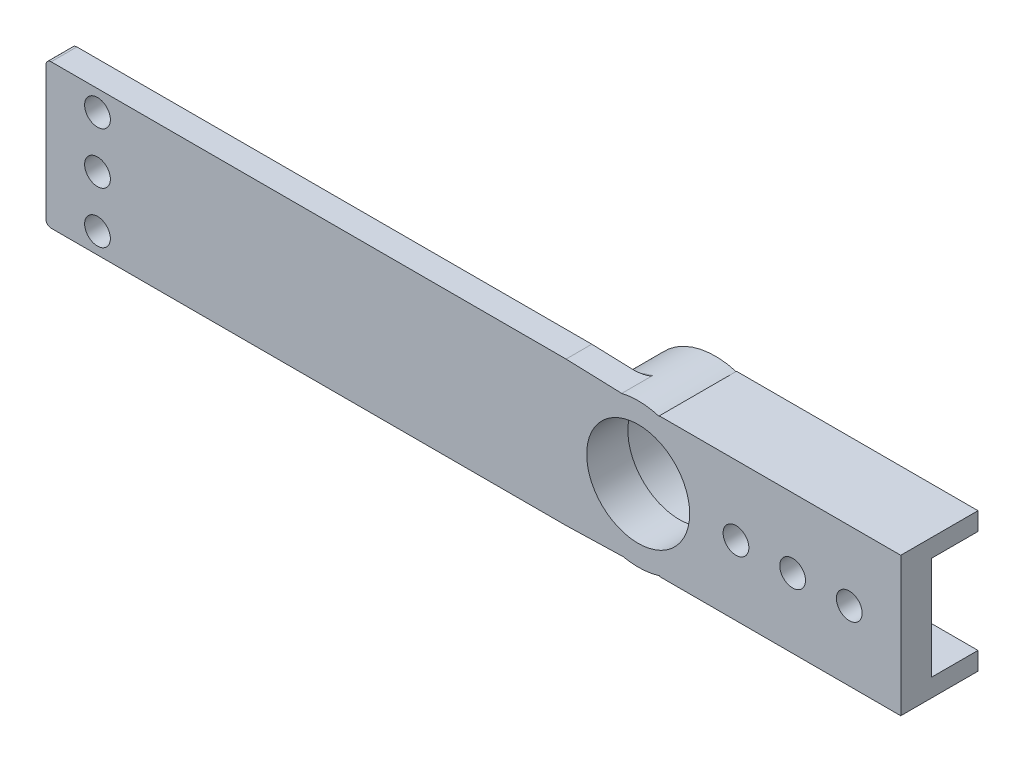
ISO-10303-21;
HEADER;
FILE_DESCRIPTION(('STEP AP214'),'2;1');
FILE_NAME('part.step','',(''),(''),'','','');
FILE_SCHEMA(('AUTOMOTIVE_DESIGN { 1 0 10303 214 1 1 1 1 }'));
ENDSEC;
DATA;
#1=APPLICATION_CONTEXT('core data for automotive mechanical design processes');
#2=APPLICATION_PROTOCOL_DEFINITION('international standard','automotive_design',2000,#1);
#3=PRODUCT_CONTEXT('',#1,'mechanical');
#4=PRODUCT('Part','Part','',(#3));
#5=PRODUCT_RELATED_PRODUCT_CATEGORY('part','',(#4));
#6=PRODUCT_DEFINITION_FORMATION('','',#4);
#7=PRODUCT_DEFINITION_CONTEXT('part definition',#1,'design');
#8=PRODUCT_DEFINITION('design','',#6,#7);
#9=PRODUCT_DEFINITION_SHAPE('','',#8);
#10=(LENGTH_UNIT() NAMED_UNIT(*) SI_UNIT(.MILLI.,.METRE.));
#11=(NAMED_UNIT(*) PLANE_ANGLE_UNIT() SI_UNIT($,.RADIAN.));
#12=(NAMED_UNIT(*) SI_UNIT($,.STERADIAN.) SOLID_ANGLE_UNIT());
#13=UNCERTAINTY_MEASURE_WITH_UNIT(LENGTH_MEASURE(1.E-05),#10,'distance_accuracy_value','');
#14=(GEOMETRIC_REPRESENTATION_CONTEXT(3) GLOBAL_UNCERTAINTY_ASSIGNED_CONTEXT((#13)) GLOBAL_UNIT_ASSIGNED_CONTEXT((#10,
#11,#12)) REPRESENTATION_CONTEXT('',''));
#15=CARTESIAN_POINT('',(0.,0.,0.));
#16=DIRECTION('',(0.,0.,1.));
#17=DIRECTION('',(1.,0.,0.));
#18=AXIS2_PLACEMENT_3D('',#15,#16,#17);
#19=CARTESIAN_POINT('',(-31.,0.,-9.));
#20=DIRECTION('',(0.,0.,1.));
#21=DIRECTION('',(1.,0.,0.));
#22=AXIS2_PLACEMENT_3D('',#19,#20,#21);
#23=CYLINDRICAL_SURFACE('',#22,14.);
#24=DIRECTION('',(0.,0.,1.));
#25=VECTOR('',#24,1.);
#26=CARTESIAN_POINT('',(-33.911999364578,-13.6938036973186,1.));
#27=LINE('',#26,#25);
#28=CARTESIAN_POINT('',(-33.911999364578,-13.6938036973186,0.));
#29=VERTEX_POINT('',#28);
#30=CARTESIAN_POINT('',(-33.911999364578,-13.6938036973186,6.));
#31=VERTEX_POINT('',#30);
#32=EDGE_CURVE('E200',#29,#31,#27,.T.);
#33=ORIENTED_EDGE('',*,*,#32,.F.);
#34=CARTESIAN_POINT('',(-31.,0.,0.));
#35=DIRECTION('',(0.,0.,1.));
#36=DIRECTION('',(1.,0.,0.));
#37=AXIS2_PLACEMENT_3D('',#34,#35,#36);
#38=CIRCLE('',#37,14.);
#39=CARTESIAN_POINT('',(-34.1873805210088,13.632336755461,0.));
#40=VERTEX_POINT('',#39);
#41=EDGE_CURVE('E426',#29,#40,#38,.F.);
#42=ORIENTED_EDGE('',*,*,#41,.T.);
#43=DIRECTION('',(0.,0.,1.));
#44=VECTOR('',#43,1.);
#45=CARTESIAN_POINT('',(-34.1873805210088,13.632336755461,1.));
#46=LINE('',#45,#44);
#47=CARTESIAN_POINT('',(-34.1873805210088,13.632336755461,6.));
#48=VERTEX_POINT('',#47);
#49=EDGE_CURVE('E245',#40,#48,#46,.T.);
#50=ORIENTED_EDGE('',*,*,#49,.T.);
#51=CARTESIAN_POINT('',(-31.,0.,6.));
#52=DIRECTION('',(0.,0.,1.));
#53=DIRECTION('',(1.,0.,0.));
#54=AXIS2_PLACEMENT_3D('',#51,#52,#53);
#55=CIRCLE('',#54,14.);
#56=CARTESIAN_POINT('',(-26.8939671408107,13.3843376436512,6.));
#57=VERTEX_POINT('',#56);
#58=EDGE_CURVE('E318',#57,#48,#55,.T.);
#59=ORIENTED_EDGE('',*,*,#58,.F.);
#60=DIRECTION('',(0.,0.,1.));
#61=VECTOR('',#60,1.);
#62=CARTESIAN_POINT('',(-26.8939671408107,13.3843376436512,-9.));
#63=LINE('',#62,#61);
#64=CARTESIAN_POINT('',(-26.8939671408107,13.3843376436512,-9.));
#65=VERTEX_POINT('',#64);
#66=EDGE_CURVE('E354',#65,#57,#63,.T.);
#67=ORIENTED_EDGE('',*,*,#66,.F.);
#68=CARTESIAN_POINT('',(-31.,0.,-9.));
#69=DIRECTION('',(0.,0.,1.));
#70=DIRECTION('',(1.,0.,0.));
#71=AXIS2_PLACEMENT_3D('',#68,#69,#70);
#72=CIRCLE('',#71,14.);
#73=CARTESIAN_POINT('',(-26.8939671408107,-13.3843376436512,-9.));
#74=VERTEX_POINT('',#73);
#75=EDGE_CURVE('E286',#65,#74,#72,.T.);
#76=ORIENTED_EDGE('',*,*,#75,.T.);
#77=DIRECTION('',(0.,0.,1.));
#78=VECTOR('',#77,1.);
#79=CARTESIAN_POINT('',(-26.8939671408107,-13.3843376436512,-9.));
#80=LINE('',#79,#78);
#81=CARTESIAN_POINT('',(-26.8939671408107,-13.3843376436512,6.));
#82=VERTEX_POINT('',#81);
#83=EDGE_CURVE('E350',#74,#82,#80,.T.);
#84=ORIENTED_EDGE('',*,*,#83,.T.);
#85=EDGE_CURVE('E317',#31,#82,#55,.T.);
#86=ORIENTED_EDGE('',*,*,#85,.F.);
#87=EDGE_LOOP('',(#33,#42,#50,#59,#67,#76,#84,#86));
#88=FACE_BOUND('',#87,.T.);
#89=ADVANCED_FACE('F45',(#88),#23,.T.);
#90=CARTESIAN_POINT('',(-31.,0.,-9.));
#91=DIRECTION('',(0.,0.,1.));
#92=DIRECTION('',(1.,0.,0.));
#93=AXIS2_PLACEMENT_3D('',#90,#91,#92);
#94=CYLINDRICAL_SURFACE('',#93,11.);
#95=CARTESIAN_POINT('',(-31.,0.,-9.));
#96=DIRECTION('',(0.,0.,1.));
#97=DIRECTION('',(1.,0.,0.));
#98=AXIS2_PLACEMENT_3D('',#95,#96,#97);
#99=CIRCLE('',#98,11.);
#100=CARTESIAN_POINT('',(-20.,0.,-9.));
#101=VERTEX_POINT('',#100);
#102=EDGE_CURVE('E259',#101,#101,#99,.T.);
#103=ORIENTED_EDGE('',*,*,#102,.F.);
#104=EDGE_LOOP('',(#103));
#105=FACE_BOUND('',#104,.T.);
#106=CARTESIAN_POINT('',(-31.,0.,-2.));
#107=DIRECTION('',(0.,0.,1.));
#108=DIRECTION('',(1.,0.,0.));
#109=AXIS2_PLACEMENT_3D('',#106,#107,#108);
#110=CIRCLE('',#109,11.);
#111=CARTESIAN_POINT('',(-20.,0.,-2.));
#112=VERTEX_POINT('',#111);
#113=EDGE_CURVE('E420',#112,#112,#110,.F.);
#114=ORIENTED_EDGE('',*,*,#113,.F.);
#115=EDGE_LOOP('',(#114));
#116=FACE_BOUND('',#115,.T.);
#117=ADVANCED_FACE('F496',(#105,#116),#94,.F.);
#118=CARTESIAN_POINT('',(20.,-10.,6.));
#119=DIRECTION('',(-1.,0.,0.));
#120=DIRECTION('',(0.,0.,1.));
#121=AXIS2_PLACEMENT_3D('',#118,#119,#120);
#122=PLANE('',#121);
#123=DIRECTION('',(0.,1.,0.));
#124=VECTOR('',#123,1.);
#125=CARTESIAN_POINT('',(20.,-10.,0.));
#126=LINE('',#125,#124);
#127=CARTESIAN_POINT('',(20.,-10.,0.));
#128=VERTEX_POINT('',#127);
#129=CARTESIAN_POINT('',(20.,10.,0.));
#130=VERTEX_POINT('',#129);
#131=EDGE_CURVE('E412',#128,#130,#126,.T.);
#132=ORIENTED_EDGE('',*,*,#131,.T.);
#133=DIRECTION('',(0.,0.,1.));
#134=VECTOR('',#133,1.);
#135=CARTESIAN_POINT('',(20.,10.,-9.));
#136=LINE('',#135,#134);
#137=CARTESIAN_POINT('',(20.,10.,-9.));
#138=VERTEX_POINT('',#137);
#139=EDGE_CURVE('E364',#138,#130,#136,.T.);
#140=ORIENTED_EDGE('',*,*,#139,.F.);
#141=DIRECTION('',(0.,-1.,0.));
#142=VECTOR('',#141,1.);
#143=CARTESIAN_POINT('',(20.,0.,-9.));
#144=LINE('',#143,#142);
#145=CARTESIAN_POINT('',(20.,13.5,-9.));
#146=VERTEX_POINT('',#145);
#147=EDGE_CURVE('E275',#146,#138,#144,.T.);
#148=ORIENTED_EDGE('',*,*,#147,.F.);
#149=DIRECTION('',(0.,0.,1.));
#150=VECTOR('',#149,1.);
#151=CARTESIAN_POINT('',(20.,13.5,-9.));
#152=LINE('',#151,#150);
#153=CARTESIAN_POINT('',(20.,13.5,6.));
#154=VERTEX_POINT('',#153);
#155=EDGE_CURVE('E360',#146,#154,#152,.T.);
#156=ORIENTED_EDGE('',*,*,#155,.T.);
#157=DIRECTION('',(0.,1.,0.));
#158=VECTOR('',#157,1.);
#159=CARTESIAN_POINT('',(20.,-10.,6.));
#160=LINE('',#159,#158);
#161=CARTESIAN_POINT('',(20.,-13.5,6.));
#162=VERTEX_POINT('',#161);
#163=EDGE_CURVE('E399',#162,#154,#160,.T.);
#164=ORIENTED_EDGE('',*,*,#163,.F.);
#165=DIRECTION('',(0.,0.,1.));
#166=VECTOR('',#165,1.);
#167=CARTESIAN_POINT('',(20.,-13.5,-9.));
#168=LINE('',#167,#166);
#169=CARTESIAN_POINT('',(20.,-13.5,-9.));
#170=VERTEX_POINT('',#169);
#171=EDGE_CURVE('E342',#170,#162,#168,.T.);
#172=ORIENTED_EDGE('',*,*,#171,.F.);
#173=DIRECTION('',(0.,-1.,0.));
#174=VECTOR('',#173,1.);
#175=CARTESIAN_POINT('',(20.,0.,-9.));
#176=LINE('',#175,#174);
#177=CARTESIAN_POINT('',(20.,-10.,-9.));
#178=VERTEX_POINT('',#177);
#179=EDGE_CURVE('E297',#178,#170,#176,.T.);
#180=ORIENTED_EDGE('',*,*,#179,.F.);
#181=DIRECTION('',(0.,0.,1.));
#182=VECTOR('',#181,1.);
#183=CARTESIAN_POINT('',(20.,-10.,-9.));
#184=LINE('',#183,#182);
#185=EDGE_CURVE('E338',#178,#128,#184,.T.);
#186=ORIENTED_EDGE('',*,*,#185,.T.);
#187=EDGE_LOOP('',(#132,#140,#148,#156,#164,#172,#180,#186));
#188=FACE_BOUND('',#187,.T.);
#189=ADVANCED_FACE('F516',(#188),#122,.F.);
#190=CARTESIAN_POINT('',(0.,0.,6.));
#191=DIRECTION('',(0.,0.,1.));
#192=DIRECTION('',(1.,0.,0.));
#193=AXIS2_PLACEMENT_3D('',#190,#191,#192);
#194=PLANE('',#193);
#195=CARTESIAN_POINT('',(-136.,-10.,6.));
#196=DIRECTION('',(0.,0.,1.));
#197=DIRECTION('',(1.,0.,0.));
#198=AXIS2_PLACEMENT_3D('',#195,#196,#197);
#199=CIRCLE('',#198,2.5);
#200=CARTESIAN_POINT('',(-133.5,-10.,6.));
#201=VERTEX_POINT('',#200);
#202=EDGE_CURVE('E651',#201,#201,#199,.T.);
#203=ORIENTED_EDGE('',*,*,#202,.F.);
#204=EDGE_LOOP('',(#203));
#205=FACE_BOUND('',#204,.T.);
#206=CARTESIAN_POINT('',(-136.,10.,6.));
#207=DIRECTION('',(0.,0.,1.));
#208=DIRECTION('',(1.,0.,0.));
#209=AXIS2_PLACEMENT_3D('',#206,#207,#208);
#210=CIRCLE('',#209,2.5);
#211=CARTESIAN_POINT('',(-133.5,10.,6.));
#212=VERTEX_POINT('',#211);
#213=EDGE_CURVE('E642',#212,#212,#210,.T.);
#214=ORIENTED_EDGE('',*,*,#213,.F.);
#215=EDGE_LOOP('',(#214));
#216=FACE_BOUND('',#215,.T.);
#217=CARTESIAN_POINT('',(-136.,0.,6.));
#218=DIRECTION('',(0.,0.,1.));
#219=DIRECTION('',(1.,0.,0.));
#220=AXIS2_PLACEMENT_3D('',#217,#218,#219);
#221=CIRCLE('',#220,2.5);
#222=CARTESIAN_POINT('',(-133.5,0.,6.));
#223=VERTEX_POINT('',#222);
#224=EDGE_CURVE('E645',#223,#223,#221,.T.);
#225=ORIENTED_EDGE('',*,*,#224,.F.);
#226=EDGE_LOOP('',(#225));
#227=FACE_BOUND('',#226,.T.);
#228=DIRECTION('',(-1.,0.,0.));
#229=VECTOR('',#228,1.);
#230=CARTESIAN_POINT('',(0.,13.9999999999999,6.));
#231=LINE('',#230,#229);
#232=CARTESIAN_POINT('',(-45.,14.,6.));
#233=VERTEX_POINT('',#232);
#234=CARTESIAN_POINT('',(-145.,14.0000000000001,6.));
#235=VERTEX_POINT('',#234);
#236=EDGE_CURVE('E237',#233,#235,#231,.T.);
#237=ORIENTED_EDGE('',*,*,#236,.T.);
#238=CARTESIAN_POINT('',(-145.,13.0000000000001,6.));
#239=DIRECTION('',(0.,0.,1.));
#240=DIRECTION('',(1.,0.,0.));
#241=AXIS2_PLACEMENT_3D('',#238,#239,#240);
#242=CIRCLE('',#241,1.);
#243=CARTESIAN_POINT('',(-146.,13.0000000000001,6.));
#244=VERTEX_POINT('',#243);
#245=EDGE_CURVE('E583',#235,#244,#242,.T.);
#246=ORIENTED_EDGE('',*,*,#245,.T.);
#247=DIRECTION('',(0.,1.,0.));
#248=VECTOR('',#247,1.);
#249=CARTESIAN_POINT('',(-146.,0.,6.));
#250=LINE('',#249,#248);
#251=CARTESIAN_POINT('',(-146.,-12.9999999999999,6.));
#252=VERTEX_POINT('',#251);
#253=EDGE_CURVE('E225',#252,#244,#250,.T.);
#254=ORIENTED_EDGE('',*,*,#253,.F.);
#255=CARTESIAN_POINT('',(-145.,-12.9999999999999,6.));
#256=DIRECTION('',(0.,0.,1.));
#257=DIRECTION('',(1.,0.,0.));
#258=AXIS2_PLACEMENT_3D('',#255,#256,#257);
#259=CIRCLE('',#258,1.);
#260=CARTESIAN_POINT('',(-145.,-13.9999999999999,6.));
#261=VERTEX_POINT('',#260);
#262=EDGE_CURVE('E580',#252,#261,#259,.T.);
#263=ORIENTED_EDGE('',*,*,#262,.T.);
#264=DIRECTION('',(-1.,0.,0.));
#265=VECTOR('',#264,1.);
#266=CARTESIAN_POINT('',(0.,-14.0000000000001,6.));
#267=LINE('',#266,#265);
#268=CARTESIAN_POINT('',(-45.,-14.,6.));
#269=VERTEX_POINT('',#268);
#270=EDGE_CURVE('E228',#269,#261,#267,.T.);
#271=ORIENTED_EDGE('',*,*,#270,.F.);
#272=DIRECTION('',(0.999618920928315,0.0276045815420301,0.));
#273=VECTOR('',#272,1.);
#274=CARTESIAN_POINT('',(0.352026286697129,-12.747599028473,6.));
#275=LINE('',#274,#273);
#276=EDGE_CURVE('E197',#269,#31,#275,.T.);
#277=ORIENTED_EDGE('',*,*,#276,.T.);
#278=ORIENTED_EDGE('',*,*,#85,.T.);
#279=DIRECTION('',(0.,1.,0.));
#280=VECTOR('',#279,1.);
#281=CARTESIAN_POINT('',(-26.8939671408107,0.,6.));
#282=LINE('',#281,#280);
#283=CARTESIAN_POINT('',(-26.8939671408107,-13.5,6.));
#284=VERTEX_POINT('',#283);
#285=EDGE_CURVE('E322',#284,#82,#282,.T.);
#286=ORIENTED_EDGE('',*,*,#285,.F.);
#287=DIRECTION('',(-1.,0.,0.));
#288=VECTOR('',#287,1.);
#289=CARTESIAN_POINT('',(0.,-13.5,6.));
#290=LINE('',#289,#288);
#291=EDGE_CURVE('E264',#162,#284,#290,.T.);
#292=ORIENTED_EDGE('',*,*,#291,.F.);
#293=ORIENTED_EDGE('',*,*,#163,.T.);
#294=DIRECTION('',(-1.,0.,0.));
#295=VECTOR('',#294,1.);
#296=CARTESIAN_POINT('',(0.,13.5,6.));
#297=LINE('',#296,#295);
#298=CARTESIAN_POINT('',(-26.8939671408107,13.5,6.));
#299=VERTEX_POINT('',#298);
#300=EDGE_CURVE('E255',#154,#299,#297,.T.);
#301=ORIENTED_EDGE('',*,*,#300,.T.);
#302=DIRECTION('',(0.,1.,0.));
#303=VECTOR('',#302,1.);
#304=CARTESIAN_POINT('',(-26.8939671408107,0.,6.));
#305=LINE('',#304,#303);
#306=EDGE_CURVE('E313',#57,#299,#305,.T.);
#307=ORIENTED_EDGE('',*,*,#306,.F.);
#308=ORIENTED_EDGE('',*,*,#58,.T.);
#309=DIRECTION('',(0.999422393339672,-0.0339835208770759,0.));
#310=VECTOR('',#309,1.);
#311=CARTESIAN_POINT('',(0.423524898662943,12.4554565547147,6.));
#312=LINE('',#311,#310);
#313=EDGE_CURVE('E234',#233,#48,#312,.T.);
#314=ORIENTED_EDGE('',*,*,#313,.F.);
#315=EDGE_LOOP('',(#237,#246,#254,#263,#271,#277,#278,#286,#292,#293,#301,#307,#308,#314));
#316=FACE_BOUND('',#315,.T.);
#317=CARTESIAN_POINT('',(10.,0.,6.));
#318=DIRECTION('',(0.,0.,1.));
#319=DIRECTION('',(1.,0.,0.));
#320=AXIS2_PLACEMENT_3D('',#317,#318,#319);
#321=CIRCLE('',#320,2.5);
#322=CARTESIAN_POINT('',(12.5,0.,6.));
#323=VERTEX_POINT('',#322);
#324=EDGE_CURVE('E380',#323,#323,#321,.T.);
#325=ORIENTED_EDGE('',*,*,#324,.F.);
#326=EDGE_LOOP('',(#325));
#327=FACE_BOUND('',#326,.T.);
#328=CARTESIAN_POINT('',(-0.999999999999999,0.,6.));
#329=DIRECTION('',(0.,0.,1.));
#330=DIRECTION('',(1.,0.,0.));
#331=AXIS2_PLACEMENT_3D('',#328,#329,#330);
#332=CIRCLE('',#331,2.5);
#333=CARTESIAN_POINT('',(1.5,0.,6.));
#334=VERTEX_POINT('',#333);
#335=EDGE_CURVE('E384',#334,#334,#332,.T.);
#336=ORIENTED_EDGE('',*,*,#335,.F.);
#337=EDGE_LOOP('',(#336));
#338=FACE_BOUND('',#337,.T.);
#339=CARTESIAN_POINT('',(-12.,-1.53625178909098E-13,6.));
#340=DIRECTION('',(0.,0.,1.));
#341=DIRECTION('',(1.,0.,0.));
#342=AXIS2_PLACEMENT_3D('',#339,#340,#341);
#343=CIRCLE('',#342,2.5);
#344=CARTESIAN_POINT('',(-9.5,-1.53625178909098E-13,6.));
#345=VERTEX_POINT('',#344);
#346=EDGE_CURVE('E392',#345,#345,#343,.T.);
#347=ORIENTED_EDGE('',*,*,#346,.F.);
#348=EDGE_LOOP('',(#347));
#349=FACE_BOUND('',#348,.T.);
#350=CARTESIAN_POINT('',(-31.,0.,6.));
#351=DIRECTION('',(0.,0.,1.));
#352=DIRECTION('',(1.,0.,0.));
#353=AXIS2_PLACEMENT_3D('',#350,#351,#352);
#354=CIRCLE('',#353,10.);
#355=CARTESIAN_POINT('',(-21.,0.,6.));
#356=VERTEX_POINT('',#355);
#357=EDGE_CURVE('E244',#356,#356,#354,.T.);
#358=ORIENTED_EDGE('',*,*,#357,.F.);
#359=EDGE_LOOP('',(#358));
#360=FACE_BOUND('',#359,.T.);
#361=ADVANCED_FACE('F530',(#205,#216,#227,#316,#327,#338,#349,#360),#194,.T.);
#362=CARTESIAN_POINT('',(0.,0.,0.));
#363=DIRECTION('',(0.,0.,1.));
#364=DIRECTION('',(1.,0.,0.));
#365=AXIS2_PLACEMENT_3D('',#362,#363,#364);
#366=PLANE('',#365);
#367=CARTESIAN_POINT('',(10.,0.,0.));
#368=DIRECTION('',(0.,0.,1.));
#369=DIRECTION('',(1.,0.,0.));
#370=AXIS2_PLACEMENT_3D('',#367,#368,#369);
#371=CIRCLE('',#370,2.5);
#372=CARTESIAN_POINT('',(12.5,0.,0.));
#373=VERTEX_POINT('',#372);
#374=EDGE_CURVE('E375',#373,#373,#371,.T.);
#375=ORIENTED_EDGE('',*,*,#374,.T.);
#376=EDGE_LOOP('',(#375));
#377=FACE_BOUND('',#376,.T.);
#378=CARTESIAN_POINT('',(-0.999999999999999,0.,0.));
#379=DIRECTION('',(0.,0.,1.));
#380=DIRECTION('',(1.,0.,0.));
#381=AXIS2_PLACEMENT_3D('',#378,#379,#380);
#382=CIRCLE('',#381,2.5);
#383=CARTESIAN_POINT('',(1.5,0.,0.));
#384=VERTEX_POINT('',#383);
#385=EDGE_CURVE('E388',#384,#384,#382,.T.);
#386=ORIENTED_EDGE('',*,*,#385,.T.);
#387=EDGE_LOOP('',(#386));
#388=FACE_BOUND('',#387,.T.);
#389=CARTESIAN_POINT('',(-12.,-1.53625178909098E-13,0.));
#390=DIRECTION('',(0.,0.,1.));
#391=DIRECTION('',(1.,0.,0.));
#392=AXIS2_PLACEMENT_3D('',#389,#390,#391);
#393=CIRCLE('',#392,2.5);
#394=CARTESIAN_POINT('',(-9.5,-1.53625178909098E-13,0.));
#395=VERTEX_POINT('',#394);
#396=EDGE_CURVE('E333',#395,#395,#393,.T.);
#397=ORIENTED_EDGE('',*,*,#396,.T.);
#398=EDGE_LOOP('',(#397));
#399=FACE_BOUND('',#398,.T.);
#400=DIRECTION('',(0.,-1.,0.));
#401=VECTOR('',#400,1.);
#402=CARTESIAN_POINT('',(-20.,-10.,0.));
#403=LINE('',#402,#401);
#404=CARTESIAN_POINT('',(-20.,-8.66025403784439,0.));
#405=VERTEX_POINT('',#404);
#406=CARTESIAN_POINT('',(-20.,-10.,0.));
#407=VERTEX_POINT('',#406);
#408=EDGE_CURVE('E379',#405,#407,#403,.T.);
#409=ORIENTED_EDGE('',*,*,#408,.F.);
#410=CARTESIAN_POINT('',(-31.,0.,0.));
#411=DIRECTION('',(0.,0.,1.));
#412=DIRECTION('',(1.,0.,0.));
#413=AXIS2_PLACEMENT_3D('',#410,#411,#412);
#414=CIRCLE('',#413,14.);
#415=CARTESIAN_POINT('',(-20.,8.66025403784439,0.));
#416=VERTEX_POINT('',#415);
#417=EDGE_CURVE('E402',#405,#416,#414,.T.);
#418=ORIENTED_EDGE('',*,*,#417,.T.);
#419=CARTESIAN_POINT('',(-20.,10.,0.));
#420=VERTEX_POINT('',#419);
#421=EDGE_CURVE('E404',#420,#416,#403,.T.);
#422=ORIENTED_EDGE('',*,*,#421,.F.);
#423=DIRECTION('',(-1.,0.,0.));
#424=VECTOR('',#423,1.);
#425=CARTESIAN_POINT('',(20.,10.,0.));
#426=LINE('',#425,#424);
#427=EDGE_CURVE('E403',#130,#420,#426,.T.);
#428=ORIENTED_EDGE('',*,*,#427,.F.);
#429=ORIENTED_EDGE('',*,*,#131,.F.);
#430=DIRECTION('',(1.,0.,0.));
#431=VECTOR('',#430,1.);
#432=CARTESIAN_POINT('',(20.,-10.,0.));
#433=LINE('',#432,#431);
#434=EDGE_CURVE('E408',#407,#128,#433,.T.);
#435=ORIENTED_EDGE('',*,*,#434,.F.);
#436=EDGE_LOOP('',(#409,#418,#422,#428,#429,#435));
#437=FACE_BOUND('',#436,.T.);
#438=ADVANCED_FACE('F528',(#377,#388,#399,#437),#366,.F.);
#439=CARTESIAN_POINT('',(-12.,-1.53625178909098E-13,0.));
#440=DIRECTION('',(0.,0.,1.));
#441=DIRECTION('',(1.,0.,0.));
#442=AXIS2_PLACEMENT_3D('',#439,#440,#441);
#443=CYLINDRICAL_SURFACE('',#442,2.5);
#444=ORIENTED_EDGE('',*,*,#396,.F.);
#445=EDGE_LOOP('',(#444));
#446=FACE_BOUND('',#445,.T.);
#447=ORIENTED_EDGE('',*,*,#346,.T.);
#448=EDGE_LOOP('',(#447));
#449=FACE_BOUND('',#448,.T.);
#450=ADVANCED_FACE('F524',(#446,#449),#443,.F.);
#451=CARTESIAN_POINT('',(-0.999999999999999,0.,0.));
#452=DIRECTION('',(0.,0.,1.));
#453=DIRECTION('',(1.,0.,0.));
#454=AXIS2_PLACEMENT_3D('',#451,#452,#453);
#455=CYLINDRICAL_SURFACE('',#454,2.5);
#456=ORIENTED_EDGE('',*,*,#385,.F.);
#457=EDGE_LOOP('',(#456));
#458=FACE_BOUND('',#457,.T.);
#459=ORIENTED_EDGE('',*,*,#335,.T.);
#460=EDGE_LOOP('',(#459));
#461=FACE_BOUND('',#460,.T.);
#462=ADVANCED_FACE('F520',(#458,#461),#455,.F.);
#463=CARTESIAN_POINT('',(10.,0.,0.));
#464=DIRECTION('',(0.,0.,1.));
#465=DIRECTION('',(1.,0.,0.));
#466=AXIS2_PLACEMENT_3D('',#463,#464,#465);
#467=CYLINDRICAL_SURFACE('',#466,2.5);
#468=ORIENTED_EDGE('',*,*,#374,.F.);
#469=EDGE_LOOP('',(#468));
#470=FACE_BOUND('',#469,.T.);
#471=ORIENTED_EDGE('',*,*,#324,.T.);
#472=EDGE_LOOP('',(#471));
#473=FACE_BOUND('',#472,.T.);
#474=ADVANCED_FACE('F512',(#470,#473),#467,.F.);
#475=CARTESIAN_POINT('',(-31.,0.,-9.));
#476=DIRECTION('',(0.,0.,1.));
#477=DIRECTION('',(1.,0.,0.));
#478=AXIS2_PLACEMENT_3D('',#475,#476,#477);
#479=CYLINDRICAL_SURFACE('',#478,14.);
#480=ORIENTED_EDGE('',*,*,#417,.F.);
#481=DIRECTION('',(0.,0.,1.));
#482=VECTOR('',#481,1.);
#483=CARTESIAN_POINT('',(-20.,-8.66025403784439,-9.));
#484=LINE('',#483,#482);
#485=CARTESIAN_POINT('',(-20.,-8.66025403784439,-9.));
#486=VERTEX_POINT('',#485);
#487=EDGE_CURVE('E329',#486,#405,#484,.T.);
#488=ORIENTED_EDGE('',*,*,#487,.F.);
#489=CARTESIAN_POINT('',(-31.,0.,-9.));
#490=DIRECTION('',(0.,0.,1.));
#491=DIRECTION('',(1.,0.,0.));
#492=AXIS2_PLACEMENT_3D('',#489,#490,#491);
#493=CIRCLE('',#492,14.);
#494=CARTESIAN_POINT('',(-20.,8.66025403784439,-9.));
#495=VERTEX_POINT('',#494);
#496=EDGE_CURVE('E263',#486,#495,#493,.T.);
#497=ORIENTED_EDGE('',*,*,#496,.T.);
#498=DIRECTION('',(0.,0.,1.));
#499=VECTOR('',#498,1.);
#500=CARTESIAN_POINT('',(-20.,8.66025403784439,-9.));
#501=LINE('',#500,#499);
#502=EDGE_CURVE('E309',#495,#416,#501,.T.);
#503=ORIENTED_EDGE('',*,*,#502,.T.);
#504=EDGE_LOOP('',(#480,#488,#497,#503));
#505=FACE_BOUND('',#504,.T.);
#506=ADVANCED_FACE('F478',(#505),#479,.T.);
#507=CARTESIAN_POINT('',(-20.,0.,-9.));
#508=DIRECTION('',(-1.,0.,0.));
#509=DIRECTION('',(0.,0.,1.));
#510=AXIS2_PLACEMENT_3D('',#507,#508,#509);
#511=PLANE('',#510);
#512=ORIENTED_EDGE('',*,*,#487,.T.);
#513=ORIENTED_EDGE('',*,*,#408,.T.);
#514=DIRECTION('',(0.,0.,1.));
#515=VECTOR('',#514,1.);
#516=CARTESIAN_POINT('',(-20.,-10.,-9.));
#517=LINE('',#516,#515);
#518=CARTESIAN_POINT('',(-20.,-10.,-9.));
#519=VERTEX_POINT('',#518);
#520=EDGE_CURVE('E334',#519,#407,#517,.T.);
#521=ORIENTED_EDGE('',*,*,#520,.F.);
#522=DIRECTION('',(0.,-1.,0.));
#523=VECTOR('',#522,1.);
#524=CARTESIAN_POINT('',(-20.,0.,-9.));
#525=LINE('',#524,#523);
#526=EDGE_CURVE('E305',#486,#519,#525,.T.);
#527=ORIENTED_EDGE('',*,*,#526,.F.);
#528=EDGE_LOOP('',(#512,#513,#521,#527));
#529=FACE_BOUND('',#528,.T.);
#530=ADVANCED_FACE('F474',(#529),#511,.F.);
#531=CARTESIAN_POINT('',(0.,-10.,-9.));
#532=DIRECTION('',(0.,-1.,0.));
#533=DIRECTION('',(1.,0.,0.));
#534=AXIS2_PLACEMENT_3D('',#531,#532,#533);
#535=PLANE('',#534);
#536=ORIENTED_EDGE('',*,*,#520,.T.);
#537=ORIENTED_EDGE('',*,*,#434,.T.);
#538=ORIENTED_EDGE('',*,*,#185,.F.);
#539=DIRECTION('',(1.,0.,0.));
#540=VECTOR('',#539,1.);
#541=CARTESIAN_POINT('',(0.,-10.,-9.));
#542=LINE('',#541,#540);
#543=EDGE_CURVE('E301',#519,#178,#542,.T.);
#544=ORIENTED_EDGE('',*,*,#543,.F.);
#545=EDGE_LOOP('',(#536,#537,#538,#544));
#546=FACE_BOUND('',#545,.T.);
#547=ADVANCED_FACE('F477',(#546),#535,.F.);
#548=CARTESIAN_POINT('',(0.,10.,-9.));
#549=DIRECTION('',(0.,1.,0.));
#550=DIRECTION('',(-1.,0.,0.));
#551=AXIS2_PLACEMENT_3D('',#548,#549,#550);
#552=PLANE('',#551);
#553=ORIENTED_EDGE('',*,*,#139,.T.);
#554=ORIENTED_EDGE('',*,*,#427,.T.);
#555=DIRECTION('',(0.,0.,1.));
#556=VECTOR('',#555,1.);
#557=CARTESIAN_POINT('',(-20.,10.,-9.));
#558=LINE('',#557,#556);
#559=CARTESIAN_POINT('',(-20.,10.,-9.));
#560=VERTEX_POINT('',#559);
#561=EDGE_CURVE('E368',#560,#420,#558,.T.);
#562=ORIENTED_EDGE('',*,*,#561,.F.);
#563=DIRECTION('',(-1.,0.,0.));
#564=VECTOR('',#563,1.);
#565=CARTESIAN_POINT('',(0.,10.,-9.));
#566=LINE('',#565,#564);
#567=EDGE_CURVE('E271',#138,#560,#566,.T.);
#568=ORIENTED_EDGE('',*,*,#567,.F.);
#569=EDGE_LOOP('',(#553,#554,#562,#568));
#570=FACE_BOUND('',#569,.T.);
#571=ADVANCED_FACE('F482',(#570),#552,.F.);
#572=CARTESIAN_POINT('',(-20.,0.,-9.));
#573=DIRECTION('',(-1.,0.,0.));
#574=DIRECTION('',(0.,0.,1.));
#575=AXIS2_PLACEMENT_3D('',#572,#573,#574);
#576=PLANE('',#575);
#577=ORIENTED_EDGE('',*,*,#561,.T.);
#578=ORIENTED_EDGE('',*,*,#421,.T.);
#579=ORIENTED_EDGE('',*,*,#502,.F.);
#580=DIRECTION('',(0.,-1.,0.));
#581=VECTOR('',#580,1.);
#582=CARTESIAN_POINT('',(-20.,0.,-9.));
#583=LINE('',#582,#581);
#584=EDGE_CURVE('E268',#560,#495,#583,.T.);
#585=ORIENTED_EDGE('',*,*,#584,.F.);
#586=EDGE_LOOP('',(#577,#578,#579,#585));
#587=FACE_BOUND('',#586,.T.);
#588=ADVANCED_FACE('F488',(#587),#576,.F.);
#589=CARTESIAN_POINT('',(0.,-13.5,-9.));
#590=DIRECTION('',(0.,1.,0.));
#591=DIRECTION('',(0.,0.,1.));
#592=AXIS2_PLACEMENT_3D('',#589,#590,#591);
#593=PLANE('',#592);
#594=ORIENTED_EDGE('',*,*,#291,.T.);
#595=DIRECTION('',(0.,0.,1.));
#596=VECTOR('',#595,1.);
#597=CARTESIAN_POINT('',(-26.8939671408107,-13.5,-9.));
#598=LINE('',#597,#596);
#599=CARTESIAN_POINT('',(-26.8939671408107,-13.5,-9.));
#600=VERTEX_POINT('',#599);
#601=EDGE_CURVE('E346',#600,#284,#598,.T.);
#602=ORIENTED_EDGE('',*,*,#601,.F.);
#603=DIRECTION('',(-1.,0.,0.));
#604=VECTOR('',#603,1.);
#605=CARTESIAN_POINT('',(0.,-13.5,-9.));
#606=LINE('',#605,#604);
#607=EDGE_CURVE('E293',#170,#600,#606,.T.);
#608=ORIENTED_EDGE('',*,*,#607,.F.);
#609=ORIENTED_EDGE('',*,*,#171,.T.);
#610=EDGE_LOOP('',(#594,#602,#608,#609));
#611=FACE_BOUND('',#610,.T.);
#612=ADVANCED_FACE('F484',(#611),#593,.F.);
#613=CARTESIAN_POINT('',(-26.8939671408107,0.,-9.));
#614=DIRECTION('',(1.,0.,0.));
#615=DIRECTION('',(0.,0.,-1.));
#616=AXIS2_PLACEMENT_3D('',#613,#614,#615);
#617=PLANE('',#616);
#618=ORIENTED_EDGE('',*,*,#285,.T.);
#619=ORIENTED_EDGE('',*,*,#83,.F.);
#620=DIRECTION('',(0.,1.,0.));
#621=VECTOR('',#620,1.);
#622=CARTESIAN_POINT('',(-26.8939671408107,0.,-9.));
#623=LINE('',#622,#621);
#624=EDGE_CURVE('E290',#600,#74,#623,.T.);
#625=ORIENTED_EDGE('',*,*,#624,.F.);
#626=ORIENTED_EDGE('',*,*,#601,.T.);
#627=EDGE_LOOP('',(#618,#619,#625,#626));
#628=FACE_BOUND('',#627,.T.);
#629=ADVANCED_FACE('F487',(#628),#617,.F.);
#630=CARTESIAN_POINT('',(-26.8939671408107,0.,-9.));
#631=DIRECTION('',(1.,0.,0.));
#632=DIRECTION('',(0.,0.,-1.));
#633=AXIS2_PLACEMENT_3D('',#630,#631,#632);
#634=PLANE('',#633);
#635=ORIENTED_EDGE('',*,*,#306,.T.);
#636=DIRECTION('',(0.,0.,1.));
#637=VECTOR('',#636,1.);
#638=CARTESIAN_POINT('',(-26.8939671408107,13.5,-9.));
#639=LINE('',#638,#637);
#640=CARTESIAN_POINT('',(-26.8939671408107,13.5,-9.));
#641=VERTEX_POINT('',#640);
#642=EDGE_CURVE('E357',#641,#299,#639,.T.);
#643=ORIENTED_EDGE('',*,*,#642,.F.);
#644=DIRECTION('',(0.,1.,0.));
#645=VECTOR('',#644,1.);
#646=CARTESIAN_POINT('',(-26.8939671408107,0.,-9.));
#647=LINE('',#646,#645);
#648=EDGE_CURVE('E283',#65,#641,#647,.T.);
#649=ORIENTED_EDGE('',*,*,#648,.F.);
#650=ORIENTED_EDGE('',*,*,#66,.T.);
#651=EDGE_LOOP('',(#635,#643,#649,#650));
#652=FACE_BOUND('',#651,.T.);
#653=ADVANCED_FACE('F492',(#652),#634,.F.);
#654=CARTESIAN_POINT('',(0.,13.5,-9.));
#655=DIRECTION('',(0.,1.,0.));
#656=DIRECTION('',(-1.,0.,0.));
#657=AXIS2_PLACEMENT_3D('',#654,#655,#656);
#658=PLANE('',#657);
#659=ORIENTED_EDGE('',*,*,#300,.F.);
#660=ORIENTED_EDGE('',*,*,#155,.F.);
#661=DIRECTION('',(-1.,0.,0.));
#662=VECTOR('',#661,1.);
#663=CARTESIAN_POINT('',(0.,13.5,-9.));
#664=LINE('',#663,#662);
#665=EDGE_CURVE('E279',#146,#641,#664,.T.);
#666=ORIENTED_EDGE('',*,*,#665,.T.);
#667=ORIENTED_EDGE('',*,*,#642,.T.);
#668=EDGE_LOOP('',(#659,#660,#666,#667));
#669=FACE_BOUND('',#668,.T.);
#670=ADVANCED_FACE('F472',(#669),#658,.T.);
#671=CARTESIAN_POINT('',(0.,0.,-9.));
#672=DIRECTION('',(0.,0.,1.));
#673=DIRECTION('',(1.,0.,0.));
#674=AXIS2_PLACEMENT_3D('',#671,#672,#673);
#675=PLANE('',#674);
#676=ORIENTED_EDGE('',*,*,#102,.T.);
#677=EDGE_LOOP('',(#676));
#678=FACE_BOUND('',#677,.T.);
#679=ORIENTED_EDGE('',*,*,#496,.F.);
#680=ORIENTED_EDGE('',*,*,#526,.T.);
#681=ORIENTED_EDGE('',*,*,#543,.T.);
#682=ORIENTED_EDGE('',*,*,#179,.T.);
#683=ORIENTED_EDGE('',*,*,#607,.T.);
#684=ORIENTED_EDGE('',*,*,#624,.T.);
#685=ORIENTED_EDGE('',*,*,#75,.F.);
#686=ORIENTED_EDGE('',*,*,#648,.T.);
#687=ORIENTED_EDGE('',*,*,#665,.F.);
#688=ORIENTED_EDGE('',*,*,#147,.T.);
#689=ORIENTED_EDGE('',*,*,#567,.T.);
#690=ORIENTED_EDGE('',*,*,#584,.T.);
#691=EDGE_LOOP('',(#679,#680,#681,#682,#683,#684,#685,#686,#687,#688,#689,#690));
#692=FACE_BOUND('',#691,.T.);
#693=ADVANCED_FACE('F468',(#678,#692),#675,.F.);
#694=CARTESIAN_POINT('',(-31.,0.,-2.));
#695=DIRECTION('',(0.,0.,1.));
#696=DIRECTION('',(1.,0.,0.));
#697=AXIS2_PLACEMENT_3D('',#694,#695,#696);
#698=PLANE('',#697);
#699=CARTESIAN_POINT('',(-31.,0.,-2.));
#700=DIRECTION('',(0.,0.,1.));
#701=DIRECTION('',(1.,0.,0.));
#702=AXIS2_PLACEMENT_3D('',#699,#700,#701);
#703=CIRCLE('',#702,10.);
#704=CARTESIAN_POINT('',(-21.,0.,-2.));
#705=VERTEX_POINT('',#704);
#706=EDGE_CURVE('E251',#705,#705,#703,.T.);
#707=ORIENTED_EDGE('',*,*,#706,.T.);
#708=EDGE_LOOP('',(#707));
#709=FACE_BOUND('',#708,.T.);
#710=ORIENTED_EDGE('',*,*,#113,.T.);
#711=EDGE_LOOP('',(#710));
#712=FACE_BOUND('',#711,.T.);
#713=ADVANCED_FACE('F464',(#709,#712),#698,.F.);
#714=CARTESIAN_POINT('',(-31.,0.,-2.));
#715=DIRECTION('',(0.,0.,1.));
#716=DIRECTION('',(1.,0.,0.));
#717=AXIS2_PLACEMENT_3D('',#714,#715,#716);
#718=CYLINDRICAL_SURFACE('',#717,10.);
#719=ORIENTED_EDGE('',*,*,#706,.F.);
#720=EDGE_LOOP('',(#719));
#721=FACE_BOUND('',#720,.T.);
#722=ORIENTED_EDGE('',*,*,#357,.T.);
#723=EDGE_LOOP('',(#722));
#724=FACE_BOUND('',#723,.T.);
#725=ADVANCED_FACE('F461',(#721,#724),#718,.F.);
#726=CARTESIAN_POINT('',(-146.,0.,1.));
#727=DIRECTION('',(1.,0.,0.));
#728=DIRECTION('',(0.,0.,-1.));
#729=AXIS2_PLACEMENT_3D('',#726,#727,#728);
#730=PLANE('',#729);
#731=ORIENTED_EDGE('',*,*,#253,.T.);
#732=DIRECTION('',(0.,0.,1.));
#733=VECTOR('',#732,1.);
#734=CARTESIAN_POINT('',(-146.,13.0000000000001,1.));
#735=LINE('',#734,#733);
#736=CARTESIAN_POINT('',(-146.,13.0000000000001,1.));
#737=VERTEX_POINT('',#736);
#738=EDGE_CURVE('E67',#244,#737,#735,.F.);
#739=ORIENTED_EDGE('',*,*,#738,.T.);
#740=DIRECTION('',(0.,1.,0.));
#741=VECTOR('',#740,1.);
#742=CARTESIAN_POINT('',(-146.,0.,1.));
#743=LINE('',#742,#741);
#744=CARTESIAN_POINT('',(-146.,-12.9999999999999,1.));
#745=VERTEX_POINT('',#744);
#746=EDGE_CURVE('E208',#745,#737,#743,.T.);
#747=ORIENTED_EDGE('',*,*,#746,.F.);
#748=DIRECTION('',(0.,0.,1.));
#749=VECTOR('',#748,1.);
#750=CARTESIAN_POINT('',(-146.,-12.9999999999999,1.));
#751=LINE('',#750,#749);
#752=EDGE_CURVE('E588',#745,#252,#751,.T.);
#753=ORIENTED_EDGE('',*,*,#752,.T.);
#754=EDGE_LOOP('',(#731,#739,#747,#753));
#755=FACE_BOUND('',#754,.T.);
#756=ADVANCED_FACE('F457',(#755),#730,.F.);
#757=CARTESIAN_POINT('',(0.,13.9999999999999,1.));
#758=DIRECTION('',(0.,1.,0.));
#759=DIRECTION('',(-1.,0.,0.));
#760=AXIS2_PLACEMENT_3D('',#757,#758,#759);
#761=PLANE('',#760);
#762=DIRECTION('',(-1.,0.,0.));
#763=VECTOR('',#762,1.);
#764=CARTESIAN_POINT('',(0.,13.9999999999999,1.));
#765=LINE('',#764,#763);
#766=CARTESIAN_POINT('',(-45.,14.,1.));
#767=VERTEX_POINT('',#766);
#768=CARTESIAN_POINT('',(-145.,14.0000000000001,1.));
#769=VERTEX_POINT('',#768);
#770=EDGE_CURVE('E201',#767,#769,#765,.T.);
#771=ORIENTED_EDGE('',*,*,#770,.T.);
#772=DIRECTION('',(0.,0.,1.));
#773=VECTOR('',#772,1.);
#774=CARTESIAN_POINT('',(-145.,14.0000000000001,6.));
#775=LINE('',#774,#773);
#776=EDGE_CURVE('E575',#769,#235,#775,.T.);
#777=ORIENTED_EDGE('',*,*,#776,.T.);
#778=ORIENTED_EDGE('',*,*,#236,.F.);
#779=DIRECTION('',(0.,0.,1.));
#780=VECTOR('',#779,1.);
#781=CARTESIAN_POINT('',(-45.,14.,1.));
#782=LINE('',#781,#780);
#783=EDGE_CURVE('E241',#767,#233,#782,.T.);
#784=ORIENTED_EDGE('',*,*,#783,.F.);
#785=EDGE_LOOP('',(#771,#777,#778,#784));
#786=FACE_BOUND('',#785,.T.);
#787=ADVANCED_FACE('F460',(#786),#761,.T.);
#788=CARTESIAN_POINT('',(0.423524898662943,12.4554565547147,1.));
#789=DIRECTION('',(-0.0339835208770759,-0.999422393339672,0.));
#790=DIRECTION('',(0.999422393339672,-0.0339835208770759,0.));
#791=AXIS2_PLACEMENT_3D('',#788,#789,#790);
#792=PLANE('',#791);
#793=ORIENTED_EDGE('',*,*,#313,.T.);
#794=ORIENTED_EDGE('',*,*,#49,.F.);
#795=CARTESIAN_POINT('',(-34.1873805210088,13.632336755461,0.));
#796=CARTESIAN_POINT('',(-34.1873086857466,13.632334312835,0.0183395667176775));
#797=CARTESIAN_POINT('',(-34.1893118747166,13.6324024275927,0.0365630013017043));
#798=CARTESIAN_POINT('',(-34.196744897519,13.6326551738662,0.0719868752258515));
#799=CARTESIAN_POINT('',(-34.2021152391686,13.6328377824598,0.0891995144719637));
#800=CARTESIAN_POINT('',(-34.2173753322784,13.6333566738677,0.126848072643649));
#801=CARTESIAN_POINT('',(-34.2280820541797,13.6337207362598,0.146941728552138));
#802=CARTESIAN_POINT('',(-34.252530894605,13.6345520741251,0.18530834595942));
#803=CARTESIAN_POINT('',(-34.2662945515155,13.6350200819715,0.203566981898554));
#804=CARTESIAN_POINT('',(-34.3088803731158,13.6364681345337,0.253789497682567));
#805=CARTESIAN_POINT('',(-34.3402390966296,13.6375344302685,0.283561541772798));
#806=CARTESIAN_POINT('',(-34.4064558561897,13.6397860094265,0.338774202216822));
#807=CARTESIAN_POINT('',(-34.441321648059,13.6409715565723,0.364204867444762));
#808=CARTESIAN_POINT('',(-34.5074547830781,13.6432202922316,0.408164209978597));
#809=CARTESIAN_POINT('',(-34.5384226824398,13.6442732987096,0.427148913638906));
#810=CARTESIAN_POINT('',(-34.601378108994,13.6464139822353,0.463355135291737));
#811=CARTESIAN_POINT('',(-34.6333661243575,13.6475016758823,0.480575791988522));
#812=CARTESIAN_POINT('',(-34.7305327941134,13.6508056498299,0.530153960911473));
#813=CARTESIAN_POINT('',(-34.7968057435007,13.6530591396197,0.560359777680457));
#814=CARTESIAN_POINT('',(-34.9315860429666,13.6576420958865,0.616820141141722));
#815=CARTESIAN_POINT('',(-35.0001070102658,13.659972025392,0.643041206830119));
#816=CARTESIAN_POINT('',(-35.1382790082064,13.6646703101292,0.692052816296685));
#817=CARTESIAN_POINT('',(-35.2079288365804,13.66703862448,0.714846774192712));
#818=CARTESIAN_POINT('',(-35.3508252287159,13.6718975535552,0.758344928341559));
#819=CARTESIAN_POINT('',(-35.4241065971095,13.6743893517471,0.778933951273743));
#820=CARTESIAN_POINT('',(-35.571411494167,13.6793981839264,0.817264661273604));
#821=CARTESIAN_POINT('',(-35.6454351227515,13.6819152213113,0.835005959370459));
#822=CARTESIAN_POINT('',(-35.8685299683636,13.6895011513385,0.884246007163939));
#823=CARTESIAN_POINT('',(-36.0185136378726,13.6946010702496,0.911727735066648));
#824=CARTESIAN_POINT('',(-36.2415070084388,13.7021835498044,0.944564329081125));
#825=CARTESIAN_POINT('',(-36.3139496152629,13.7046468274513,0.953990998579576));
#826=CARTESIAN_POINT('',(-36.4591201372004,13.7095830841291,0.9703302226166));
#827=CARTESIAN_POINT('',(-36.5318480394035,13.7120560627208,0.977242889622741));
#828=CARTESIAN_POINT('',(-36.6773896426075,13.7170049373347,0.988435553839622));
#829=CARTESIAN_POINT('',(-36.7502030181252,13.7194808222894,0.992719762169461));
#830=CARTESIAN_POINT('',(-36.8959501010275,13.7244366838627,0.998497555125776));
#831=CARTESIAN_POINT('',(-36.9688838247989,13.7269166610384,0.999990721762665));
#832=CARTESIAN_POINT('',(-37.041825895934,13.7293969220509,1.));
#833=B_SPLINE_CURVE_WITH_KNOTS('',3,(#795,#796,#797,#798,#799,#800,#801,#802,#803,#804,#805,
#806,#807,#808,#809,#810,#811,#812,#813,#814,#815,#816,#817,#818,#819,#820,#821,#822,#823,#824,
#825,#826,#827,#828,#829,#830,#831,#832),.UNSPECIFIED.,.F.,.F.,(4,2,2,2,2,2,2,2,2,2,2,2,2,2,2,2,
2,2,4),(0.,0.0547244036036571,0.108508153837957,0.176431535836051,0.24484959202311,
0.373892376434794,0.50322708750504,0.61216865781622,0.721163167823324,0.939534329230642,
1.15964939036868,1.37954369675625,1.60795711149045,1.83640169871975,2.2936392846521,
2.51289376697889,2.73213843942971,2.95103093096041,3.16995620145469),.UNSPECIFIED.);
#834=CARTESIAN_POINT('',(-37.041825895934,13.7293969220509,1.));
#835=VERTEX_POINT('',#834);
#836=EDGE_CURVE('E439',#40,#835,#833,.T.);
#837=ORIENTED_EDGE('',*,*,#836,.T.);
#838=DIRECTION('',(0.999422393339672,-0.0339835208770759,0.));
#839=VECTOR('',#838,1.);
#840=CARTESIAN_POINT('',(0.423524898662943,12.4554565547147,1.));
#841=LINE('',#840,#839);
#842=EDGE_CURVE('E216',#767,#835,#841,.T.);
#843=ORIENTED_EDGE('',*,*,#842,.F.);
#844=ORIENTED_EDGE('',*,*,#783,.T.);
#845=EDGE_LOOP('',(#793,#794,#837,#843,#844));
#846=FACE_BOUND('',#845,.T.);
#847=ADVANCED_FACE('F452',(#846),#792,.F.);
#848=CARTESIAN_POINT('',(0.352026286697129,-12.747599028473,1.));
#849=DIRECTION('',(0.0276045815420301,-0.999618920928315,0.));
#850=DIRECTION('',(0.999618920928315,0.0276045815420301,0.));
#851=AXIS2_PLACEMENT_3D('',#848,#849,#850);
#852=PLANE('',#851);
#853=ORIENTED_EDGE('',*,*,#276,.F.);
#854=DIRECTION('',(0.,0.,1.));
#855=VECTOR('',#854,1.);
#856=CARTESIAN_POINT('',(-45.,-14.,1.));
#857=LINE('',#856,#855);
#858=CARTESIAN_POINT('',(-45.,-14.,1.));
#859=VERTEX_POINT('',#858);
#860=EDGE_CURVE('E191',#859,#269,#857,.T.);
#861=ORIENTED_EDGE('',*,*,#860,.F.);
#862=DIRECTION('',(0.999618920928315,0.0276045815420301,0.));
#863=VECTOR('',#862,1.);
#864=CARTESIAN_POINT('',(0.352026286697129,-12.747599028473,1.));
#865=LINE('',#864,#863);
#866=CARTESIAN_POINT('',(-36.9320078774141,-13.777201549745,1.));
#867=VERTEX_POINT('',#866);
#868=EDGE_CURVE('E195',#859,#867,#865,.T.);
#869=ORIENTED_EDGE('',*,*,#868,.T.);
#870=CARTESIAN_POINT('',(-36.9320078774141,-13.777201549745,1.));
#871=CARTESIAN_POINT('',(-36.8478442740732,-13.7748773629948,0.999985542118329));
#872=CARTESIAN_POINT('',(-36.7636937386139,-13.7725535371155,0.99811866621793));
#873=CARTESIAN_POINT('',(-36.5955537594663,-13.7679103339231,0.990941637281726));
#874=CARTESIAN_POINT('',(-36.5115642882581,-13.76559095585,0.985632137213797));
#875=CARTESIAN_POINT('',(-36.3437053817906,-13.7609555145092,0.971819365596888));
#876=CARTESIAN_POINT('',(-36.2598364003427,-13.7586394637735,0.963310625207871));
#877=CARTESIAN_POINT('',(-36.0924649326926,-13.7540174831068,0.943260060156913));
#878=CARTESIAN_POINT('',(-36.0089624644578,-13.751711553672,0.931718088449613));
#879=CARTESIAN_POINT('',(-35.757598142142,-13.7447701014978,0.892486131205887));
#880=CARTESIAN_POINT('',(-35.5903988485334,-13.7401528754354,0.860319102164036));
#881=CARTESIAN_POINT('',(-35.3418127526557,-13.7332881442761,0.802988571040369));
#882=CARTESIAN_POINT('',(-35.2593469272822,-13.7310108418429,0.782373531913381));
#883=CARTESIAN_POINT('',(-35.0953093375598,-13.7264809265655,0.737854432188639));
#884=CARTESIAN_POINT('',(-35.0137373863812,-13.7242283085621,0.713951073609741));
#885=CARTESIAN_POINT('',(-34.9001141100688,-13.7210905898471,0.67776247054054));
#886=CARTESIAN_POINT('',(-34.8675565341649,-13.7201915089673,0.667055135075385));
#887=CARTESIAN_POINT('',(-34.8026712808989,-13.7183996958802,0.644971775810154));
#888=CARTESIAN_POINT('',(-34.7703435914547,-13.7175069633392,0.633595787447556));
#889=CARTESIAN_POINT('',(-34.6738587868803,-13.7148425253222,0.598414883921477));
#890=CARTESIAN_POINT('',(-34.610088041556,-13.713081489489,0.57352185625011));
#891=CARTESIAN_POINT('',(-34.5030404928522,-13.7101253601829,0.528081468340895));
#892=CARTESIAN_POINT('',(-34.459364250179,-13.708919236152,0.508476365010177));
#893=CARTESIAN_POINT('',(-34.3729930251037,-13.7065340856956,0.466953624928089));
#894=CARTESIAN_POINT('',(-34.3303002383174,-13.7053551199023,0.445031328944724));
#895=CARTESIAN_POINT('',(-34.244257739324,-13.7029790472512,0.396887082766441));
#896=CARTESIAN_POINT('',(-34.2010033889667,-13.7017845738209,0.370493883344083));
#897=CARTESIAN_POINT('',(-34.1177759757973,-13.6994862400606,0.312942228212993));
#898=CARTESIAN_POINT('',(-34.0777910038941,-13.6983820508598,0.281802370614684));
#899=CARTESIAN_POINT('',(-34.0266837218722,-13.6969707178964,0.232872627687481));
#900=CARTESIAN_POINT('',(-34.0125928080898,-13.6965815958316,0.218225719323281));
#901=CARTESIAN_POINT('',(-33.9861036347424,-13.6958500945262,0.187426440072163));
#902=CARTESIAN_POINT('',(-33.973705872103,-13.6955077290081,0.171273629546114));
#903=CARTESIAN_POINT('',(-33.9532271380097,-13.6949422066142,0.140000328596772));
#904=CARTESIAN_POINT('',(-33.9447728158935,-13.6947087396206,0.125128735709922));
#905=CARTESIAN_POINT('',(-33.9303857646158,-13.6943114396877,0.0942422319701471));
#906=CARTESIAN_POINT('',(-33.9244419947523,-13.6941473018584,0.0782326966141947));
#907=CARTESIAN_POINT('',(-33.9174829468572,-13.6939551270195,0.0517533259183369));
#908=CARTESIAN_POINT('',(-33.915449980327,-13.6938989864351,0.0415493714154409));
#909=CARTESIAN_POINT('',(-33.9126975443017,-13.6938229776251,0.0209028921231384));
#910=CARTESIAN_POINT('',(-33.9119863293757,-13.6938033373502,0.0104592777040269));
#911=CARTESIAN_POINT('',(-33.911999364578,-13.6938036973186,0.));
#912=B_SPLINE_CURVE_WITH_KNOTS('',3,(#870,#871,#872,#873,#874,#875,#876,#877,#878,#879,#880,
#881,#882,#883,#884,#885,#886,#887,#888,#889,#890,#891,#892,#893,#894,#895,#896,#897,#898,#899,
#900,#901,#902,#903,#904,#905,#906,#907,#908,#909,#910,#911),.UNSPECIFIED.,.F.,.F.,(4,2,2,2,2,2,
2,2,2,2,2,2,2,2,2,2,2,2,2,2,4),(0.,0.252547566835353,0.505047246588033,0.75798053089077,
1.01092607918672,1.5213843801444,1.77644180166603,2.03144485558454,2.13429323389308,
2.23713616631687,2.4424702852783,2.58609602082027,2.73001624889136,2.88193520853105,
3.0332735413277,3.0941716103882,3.15508751428493,3.20624867829051,3.25718244635197,
3.28831590989155,3.31964316229443),.UNSPECIFIED.);
#913=EDGE_CURVE('E430',#867,#29,#912,.T.);
#914=ORIENTED_EDGE('',*,*,#913,.T.);
#915=ORIENTED_EDGE('',*,*,#32,.T.);
#916=EDGE_LOOP('',(#853,#861,#869,#914,#915));
#917=FACE_BOUND('',#916,.T.);
#918=ADVANCED_FACE('F192',(#917),#852,.T.);
#919=CARTESIAN_POINT('',(0.,-14.0000000000001,1.));
#920=DIRECTION('',(0.,1.,0.));
#921=DIRECTION('',(-1.,0.,0.));
#922=AXIS2_PLACEMENT_3D('',#919,#920,#921);
#923=PLANE('',#922);
#924=ORIENTED_EDGE('',*,*,#270,.T.);
#925=DIRECTION('',(0.,0.,1.));
#926=VECTOR('',#925,1.);
#927=CARTESIAN_POINT('',(-145.,-13.9999999999999,1.));
#928=LINE('',#927,#926);
#929=CARTESIAN_POINT('',(-145.,-13.9999999999999,1.));
#930=VERTEX_POINT('',#929);
#931=EDGE_CURVE('E11',#261,#930,#928,.F.);
#932=ORIENTED_EDGE('',*,*,#931,.T.);
#933=DIRECTION('',(-1.,0.,0.));
#934=VECTOR('',#933,1.);
#935=CARTESIAN_POINT('',(0.,-14.0000000000001,1.));
#936=LINE('',#935,#934);
#937=EDGE_CURVE('E203',#859,#930,#936,.T.);
#938=ORIENTED_EDGE('',*,*,#937,.F.);
#939=ORIENTED_EDGE('',*,*,#860,.T.);
#940=EDGE_LOOP('',(#924,#932,#938,#939));
#941=FACE_BOUND('',#940,.T.);
#942=ADVANCED_FACE('F204',(#941),#923,.F.);
#943=CARTESIAN_POINT('',(0.,0.,1.));
#944=DIRECTION('',(0.,0.,1.));
#945=DIRECTION('',(1.,0.,0.));
#946=AXIS2_PLACEMENT_3D('',#943,#944,#945);
#947=PLANE('',#946);
#948=CARTESIAN_POINT('',(-136.,-10.,1.));
#949=DIRECTION('',(0.,0.,1.));
#950=DIRECTION('',(1.,0.,0.));
#951=AXIS2_PLACEMENT_3D('',#948,#949,#950);
#952=CIRCLE('',#951,2.5);
#953=CARTESIAN_POINT('',(-133.5,-10.,1.));
#954=VERTEX_POINT('',#953);
#955=EDGE_CURVE('E657',#954,#954,#952,.T.);
#956=ORIENTED_EDGE('',*,*,#955,.T.);
#957=EDGE_LOOP('',(#956));
#958=FACE_BOUND('',#957,.T.);
#959=CARTESIAN_POINT('',(-136.,10.,1.));
#960=DIRECTION('',(0.,0.,1.));
#961=DIRECTION('',(1.,0.,0.));
#962=AXIS2_PLACEMENT_3D('',#959,#960,#961);
#963=CIRCLE('',#962,2.5);
#964=CARTESIAN_POINT('',(-133.5,10.,1.));
#965=VERTEX_POINT('',#964);
#966=EDGE_CURVE('E639',#965,#965,#963,.T.);
#967=ORIENTED_EDGE('',*,*,#966,.T.);
#968=EDGE_LOOP('',(#967));
#969=FACE_BOUND('',#968,.T.);
#970=CARTESIAN_POINT('',(-136.,0.,1.));
#971=DIRECTION('',(0.,0.,1.));
#972=DIRECTION('',(1.,0.,0.));
#973=AXIS2_PLACEMENT_3D('',#970,#971,#972);
#974=CIRCLE('',#973,2.5);
#975=CARTESIAN_POINT('',(-133.5,0.,1.));
#976=VERTEX_POINT('',#975);
#977=EDGE_CURVE('E229',#976,#976,#974,.T.);
#978=ORIENTED_EDGE('',*,*,#977,.T.);
#979=EDGE_LOOP('',(#978));
#980=FACE_BOUND('',#979,.T.);
#981=ORIENTED_EDGE('',*,*,#746,.T.);
#982=CARTESIAN_POINT('',(-145.,13.0000000000001,1.));
#983=DIRECTION('',(0.,0.,1.));
#984=DIRECTION('',(1.,0.,0.));
#985=AXIS2_PLACEMENT_3D('',#982,#983,#984);
#986=CIRCLE('',#985,1.);
#987=EDGE_CURVE('E54',#737,#769,#986,.F.);
#988=ORIENTED_EDGE('',*,*,#987,.T.);
#989=ORIENTED_EDGE('',*,*,#770,.F.);
#990=ORIENTED_EDGE('',*,*,#842,.T.);
#991=CARTESIAN_POINT('',(-31.,0.,1.));
#992=DIRECTION('',(0.,0.,1.));
#993=DIRECTION('',(1.,0.,0.));
#994=AXIS2_PLACEMENT_3D('',#991,#992,#993);
#995=CIRCLE('',#994,15.);
#996=EDGE_CURVE('E214',#835,#867,#995,.T.);
#997=ORIENTED_EDGE('',*,*,#996,.T.);
#998=ORIENTED_EDGE('',*,*,#868,.F.);
#999=ORIENTED_EDGE('',*,*,#937,.T.);
#1000=CARTESIAN_POINT('',(-145.,-12.9999999999999,1.));
#1001=DIRECTION('',(0.,0.,1.));
#1002=DIRECTION('',(1.,0.,0.));
#1003=AXIS2_PLACEMENT_3D('',#1000,#1001,#1002);
#1004=CIRCLE('',#1003,1.);
#1005=EDGE_CURVE('E594',#930,#745,#1004,.F.);
#1006=ORIENTED_EDGE('',*,*,#1005,.T.);
#1007=EDGE_LOOP('',(#981,#988,#989,#990,#997,#998,#999,#1006));
#1008=FACE_BOUND('',#1007,.T.);
#1009=ADVANCED_FACE('F211',(#958,#969,#980,#1008),#947,.F.);
#1010=CARTESIAN_POINT('',(-31.,0.,0.));
#1011=DIRECTION('',(0.,0.,1.));
#1012=DIRECTION('',(1.,0.,0.));
#1013=AXIS2_PLACEMENT_3D('',#1010,#1011,#1012);
#1014=TOROIDAL_SURFACE('',#1013,15.,1.);
#1015=ORIENTED_EDGE('',*,*,#836,.F.);
#1016=ORIENTED_EDGE('',*,*,#41,.F.);
#1017=ORIENTED_EDGE('',*,*,#913,.F.);
#1018=ORIENTED_EDGE('',*,*,#996,.F.);
#1019=EDGE_LOOP('',(#1015,#1016,#1017,#1018));
#1020=FACE_BOUND('',#1019,.T.);
#1021=ADVANCED_FACE('F446',(#1020),#1014,.F.);
#1022=CARTESIAN_POINT('',(-145.,13.0000000000001,1.));
#1023=DIRECTION('',(0.,0.,-1.));
#1024=DIRECTION('',(-1.,0.,0.));
#1025=AXIS2_PLACEMENT_3D('',#1022,#1023,#1024);
#1026=CYLINDRICAL_SURFACE('',#1025,1.);
#1027=ORIENTED_EDGE('',*,*,#987,.F.);
#1028=ORIENTED_EDGE('',*,*,#738,.F.);
#1029=ORIENTED_EDGE('',*,*,#245,.F.);
#1030=ORIENTED_EDGE('',*,*,#776,.F.);
#1031=EDGE_LOOP('',(#1027,#1028,#1029,#1030));
#1032=FACE_BOUND('',#1031,.T.);
#1033=ADVANCED_FACE('F597',(#1032),#1026,.T.);
#1034=CARTESIAN_POINT('',(-145.,-12.9999999999999,1.));
#1035=DIRECTION('',(0.,0.,1.));
#1036=DIRECTION('',(1.,0.,0.));
#1037=AXIS2_PLACEMENT_3D('',#1034,#1035,#1036);
#1038=CYLINDRICAL_SURFACE('',#1037,1.);
#1039=ORIENTED_EDGE('',*,*,#1005,.F.);
#1040=ORIENTED_EDGE('',*,*,#931,.F.);
#1041=ORIENTED_EDGE('',*,*,#262,.F.);
#1042=ORIENTED_EDGE('',*,*,#752,.F.);
#1043=EDGE_LOOP('',(#1039,#1040,#1041,#1042));
#1044=FACE_BOUND('',#1043,.T.);
#1045=ADVANCED_FACE('F47',(#1044),#1038,.T.);
#1046=CARTESIAN_POINT('',(-136.,0.,1.));
#1047=DIRECTION('',(0.,0.,1.));
#1048=DIRECTION('',(1.,0.,0.));
#1049=AXIS2_PLACEMENT_3D('',#1046,#1047,#1048);
#1050=CYLINDRICAL_SURFACE('',#1049,2.5);
#1051=ORIENTED_EDGE('',*,*,#977,.F.);
#1052=EDGE_LOOP('',(#1051));
#1053=FACE_BOUND('',#1052,.T.);
#1054=ORIENTED_EDGE('',*,*,#224,.T.);
#1055=EDGE_LOOP('',(#1054));
#1056=FACE_BOUND('',#1055,.T.);
#1057=ADVANCED_FACE('F602',(#1053,#1056),#1050,.F.);
#1058=CARTESIAN_POINT('',(-136.,10.,1.));
#1059=DIRECTION('',(0.,0.,1.));
#1060=DIRECTION('',(1.,0.,0.));
#1061=AXIS2_PLACEMENT_3D('',#1058,#1059,#1060);
#1062=CYLINDRICAL_SURFACE('',#1061,2.5);
#1063=ORIENTED_EDGE('',*,*,#966,.F.);
#1064=EDGE_LOOP('',(#1063));
#1065=FACE_BOUND('',#1064,.T.);
#1066=ORIENTED_EDGE('',*,*,#213,.T.);
#1067=EDGE_LOOP('',(#1066));
#1068=FACE_BOUND('',#1067,.T.);
#1069=ADVANCED_FACE('F607',(#1065,#1068),#1062,.F.);
#1070=CARTESIAN_POINT('',(-136.,-10.,1.));
#1071=DIRECTION('',(0.,0.,1.));
#1072=DIRECTION('',(1.,0.,0.));
#1073=AXIS2_PLACEMENT_3D('',#1070,#1071,#1072);
#1074=CYLINDRICAL_SURFACE('',#1073,2.5);
#1075=ORIENTED_EDGE('',*,*,#955,.F.);
#1076=EDGE_LOOP('',(#1075));
#1077=FACE_BOUND('',#1076,.T.);
#1078=ORIENTED_EDGE('',*,*,#202,.T.);
#1079=EDGE_LOOP('',(#1078));
#1080=FACE_BOUND('',#1079,.T.);
#1081=ADVANCED_FACE('F628',(#1077,#1080),#1074,.F.);
#1082=CLOSED_SHELL('',(#89,#117,#189,#361,#438,#450,#462,#474,#506,#530,#547,#571,#588,#612,
#629,#653,#670,#693,#713,#725,#756,#787,#847,#918,#942,#1009,#1021,#1033,#1045,#1057,#1069,#1081));
#1083=MANIFOLD_SOLID_BREP('B2',#1082);
#1084=ADVANCED_BREP_SHAPE_REPRESENTATION('',(#18,#1083),#14);
#1085=SHAPE_DEFINITION_REPRESENTATION(#9,#1084);
ENDSEC;
END-ISO-10303-21;
